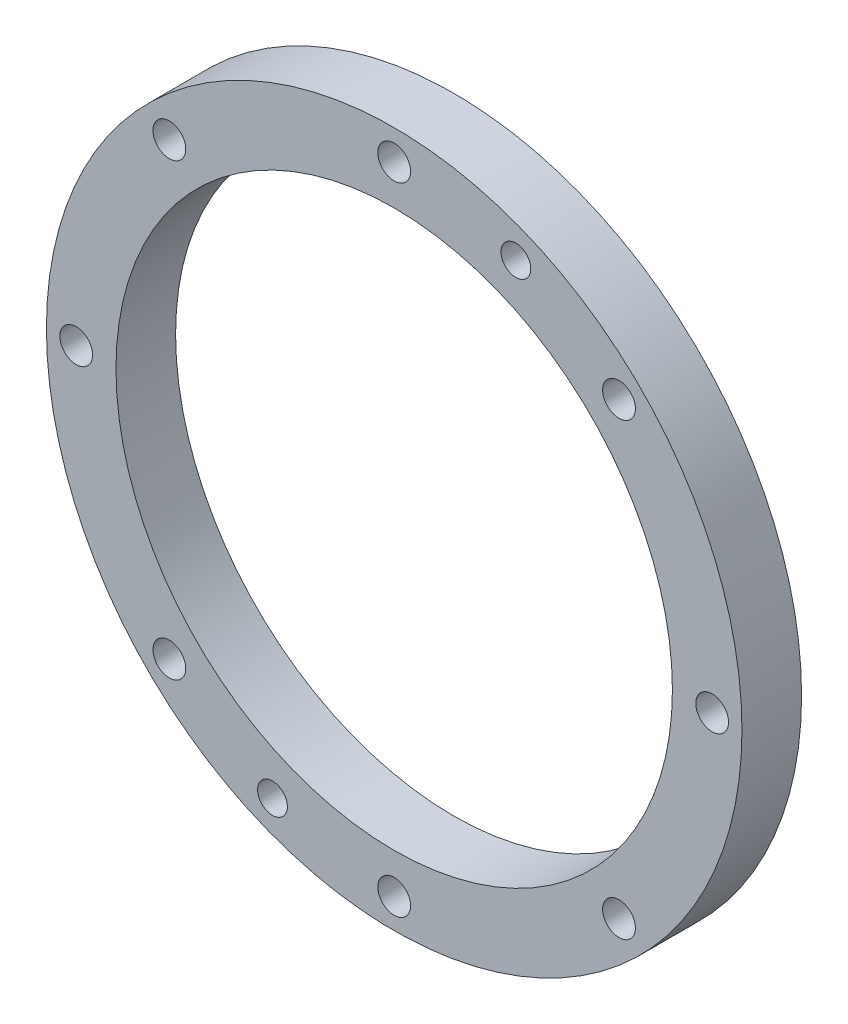
ISO-10303-21;
HEADER;
FILE_DESCRIPTION(('STEP AP214'),'2;1');
FILE_NAME('part.step','',(''),(''),'','','');
FILE_SCHEMA(('AUTOMOTIVE_DESIGN { 1 0 10303 214 1 1 1 1 }'));
ENDSEC;
DATA;
#1=APPLICATION_CONTEXT('core data for automotive mechanical design processes');
#2=APPLICATION_PROTOCOL_DEFINITION('international standard','automotive_design',2000,#1);
#3=PRODUCT_CONTEXT('',#1,'mechanical');
#4=PRODUCT('Part','Part','',(#3));
#5=PRODUCT_RELATED_PRODUCT_CATEGORY('part','',(#4));
#6=PRODUCT_DEFINITION_FORMATION('','',#4);
#7=PRODUCT_DEFINITION_CONTEXT('part definition',#1,'design');
#8=PRODUCT_DEFINITION('design','',#6,#7);
#9=PRODUCT_DEFINITION_SHAPE('','',#8);
#10=(LENGTH_UNIT() NAMED_UNIT(*) SI_UNIT(.MILLI.,.METRE.));
#11=(NAMED_UNIT(*) PLANE_ANGLE_UNIT() SI_UNIT($,.RADIAN.));
#12=(NAMED_UNIT(*) SI_UNIT($,.STERADIAN.) SOLID_ANGLE_UNIT());
#13=UNCERTAINTY_MEASURE_WITH_UNIT(LENGTH_MEASURE(1.E-05),#10,'distance_accuracy_value','');
#14=(GEOMETRIC_REPRESENTATION_CONTEXT(3) GLOBAL_UNCERTAINTY_ASSIGNED_CONTEXT((#13)) GLOBAL_UNIT_ASSIGNED_CONTEXT((#10,
#11,#12)) REPRESENTATION_CONTEXT('',''));
#15=CARTESIAN_POINT('',(0.,0.,0.));
#16=DIRECTION('',(0.,0.,1.));
#17=DIRECTION('',(1.,0.,0.));
#18=AXIS2_PLACEMENT_3D('',#15,#16,#17);
#19=CARTESIAN_POINT('',(0.,0.,150.));
#20=DIRECTION('',(0.,0.,1.));
#21=DIRECTION('',(1.,0.,0.));
#22=AXIS2_PLACEMENT_3D('',#19,#20,#21);
#23=CYLINDRICAL_SURFACE('',#22,56.);
#24=CARTESIAN_POINT('',(0.,0.,-7.50000000000001));
#25=DIRECTION('',(0.,0.,1.));
#26=DIRECTION('',(1.,0.,0.));
#27=AXIS2_PLACEMENT_3D('',#24,#25,#26);
#28=CIRCLE('',#27,56.);
#29=CARTESIAN_POINT('',(56.,0.,-7.50000000000001));
#30=VERTEX_POINT('',#29);
#31=EDGE_CURVE('E117',#30,#30,#28,.T.);
#32=ORIENTED_EDGE('',*,*,#31,.T.);
#33=EDGE_LOOP('',(#32));
#34=FACE_BOUND('',#33,.T.);
#35=CARTESIAN_POINT('',(0.,0.,-19.5));
#36=DIRECTION('',(0.,0.,1.));
#37=DIRECTION('',(1.,0.,0.));
#38=AXIS2_PLACEMENT_3D('',#35,#36,#37);
#39=CIRCLE('',#38,56.);
#40=CARTESIAN_POINT('',(56.,0.,-19.5));
#41=VERTEX_POINT('',#40);
#42=EDGE_CURVE('E10',#41,#41,#39,.T.);
#43=ORIENTED_EDGE('',*,*,#42,.F.);
#44=EDGE_LOOP('',(#43));
#45=FACE_BOUND('',#44,.T.);
#46=ADVANCED_FACE('F39',(#34,#45),#23,.F.);
#47=CARTESIAN_POINT('',(56.,0.,-19.5));
#48=DIRECTION('',(0.,0.,-1.));
#49=DIRECTION('',(-1.,0.,0.));
#50=AXIS2_PLACEMENT_3D('',#47,#48,#49);
#51=PLANE('',#50);
#52=CARTESIAN_POINT('',(64.,0.,-19.5));
#53=DIRECTION('',(0.,0.,-1.));
#54=DIRECTION('',(-1.,0.,0.));
#55=AXIS2_PLACEMENT_3D('',#52,#53,#54);
#56=CIRCLE('',#55,3.3);
#57=CARTESIAN_POINT('',(60.7,0.,-19.5));
#58=VERTEX_POINT('',#57);
#59=EDGE_CURVE('E118',#58,#58,#56,.F.);
#60=ORIENTED_EDGE('',*,*,#59,.T.);
#61=EDGE_LOOP('',(#60));
#62=FACE_BOUND('',#61,.T.);
#63=CARTESIAN_POINT('',(-24.4917,-59.1283,-19.5));
#64=DIRECTION('',(0.,0.,-1.));
#65=DIRECTION('',(-1.,0.,0.));
#66=AXIS2_PLACEMENT_3D('',#63,#64,#65);
#67=CIRCLE('',#66,3.);
#68=CARTESIAN_POINT('',(-27.4917,-59.1283,-19.5));
#69=VERTEX_POINT('',#68);
#70=EDGE_CURVE('E99',#69,#69,#67,.F.);
#71=ORIENTED_EDGE('',*,*,#70,.T.);
#72=EDGE_LOOP('',(#71));
#73=FACE_BOUND('',#72,.T.);
#74=CARTESIAN_POINT('',(45.2548,45.2548,-19.5));
#75=DIRECTION('',(0.,0.,-1.));
#76=DIRECTION('',(-1.,0.,0.));
#77=AXIS2_PLACEMENT_3D('',#74,#75,#76);
#78=CIRCLE('',#77,3.3);
#79=CARTESIAN_POINT('',(41.9548,45.2548,-19.5));
#80=VERTEX_POINT('',#79);
#81=EDGE_CURVE('E96',#80,#80,#78,.F.);
#82=ORIENTED_EDGE('',*,*,#81,.T.);
#83=EDGE_LOOP('',(#82));
#84=FACE_BOUND('',#83,.T.);
#85=CARTESIAN_POINT('',(0.,64.,-19.5));
#86=DIRECTION('',(0.,0.,-1.));
#87=DIRECTION('',(-1.,0.,0.));
#88=AXIS2_PLACEMENT_3D('',#85,#86,#87);
#89=CIRCLE('',#88,3.3);
#90=CARTESIAN_POINT('',(-3.3,64.,-19.5));
#91=VERTEX_POINT('',#90);
#92=EDGE_CURVE('E95',#91,#91,#89,.F.);
#93=ORIENTED_EDGE('',*,*,#92,.T.);
#94=EDGE_LOOP('',(#93));
#95=FACE_BOUND('',#94,.T.);
#96=CARTESIAN_POINT('',(-45.2548,45.2548,-19.5));
#97=DIRECTION('',(0.,0.,-1.));
#98=DIRECTION('',(-1.,0.,0.));
#99=AXIS2_PLACEMENT_3D('',#96,#97,#98);
#100=CIRCLE('',#99,3.3);
#101=CARTESIAN_POINT('',(-48.5548,45.2548,-19.5));
#102=VERTEX_POINT('',#101);
#103=EDGE_CURVE('E87',#102,#102,#100,.F.);
#104=ORIENTED_EDGE('',*,*,#103,.T.);
#105=EDGE_LOOP('',(#104));
#106=FACE_BOUND('',#105,.T.);
#107=CARTESIAN_POINT('',(-64.,0.,-19.5));
#108=DIRECTION('',(0.,0.,-1.));
#109=DIRECTION('',(-1.,0.,0.));
#110=AXIS2_PLACEMENT_3D('',#107,#108,#109);
#111=CIRCLE('',#110,3.3);
#112=CARTESIAN_POINT('',(-67.3,0.,-19.5));
#113=VERTEX_POINT('',#112);
#114=EDGE_CURVE('E85',#113,#113,#111,.F.);
#115=ORIENTED_EDGE('',*,*,#114,.T.);
#116=EDGE_LOOP('',(#115));
#117=FACE_BOUND('',#116,.T.);
#118=CARTESIAN_POINT('',(-45.2548,-45.2548,-19.5));
#119=DIRECTION('',(0.,0.,-1.));
#120=DIRECTION('',(-1.,0.,0.));
#121=AXIS2_PLACEMENT_3D('',#118,#119,#120);
#122=CIRCLE('',#121,3.3);
#123=CARTESIAN_POINT('',(-48.5548,-45.2548,-19.5));
#124=VERTEX_POINT('',#123);
#125=EDGE_CURVE('E80',#124,#124,#122,.F.);
#126=ORIENTED_EDGE('',*,*,#125,.T.);
#127=EDGE_LOOP('',(#126));
#128=FACE_BOUND('',#127,.T.);
#129=CARTESIAN_POINT('',(0.,-64.,-19.5));
#130=DIRECTION('',(0.,0.,-1.));
#131=DIRECTION('',(-1.,0.,0.));
#132=AXIS2_PLACEMENT_3D('',#129,#130,#131);
#133=CIRCLE('',#132,3.3);
#134=CARTESIAN_POINT('',(-3.3,-64.,-19.5));
#135=VERTEX_POINT('',#134);
#136=EDGE_CURVE('E75',#135,#135,#133,.F.);
#137=ORIENTED_EDGE('',*,*,#136,.T.);
#138=EDGE_LOOP('',(#137));
#139=FACE_BOUND('',#138,.T.);
#140=CARTESIAN_POINT('',(45.2548,-45.2548,-19.5));
#141=DIRECTION('',(0.,0.,-1.));
#142=DIRECTION('',(-1.,0.,0.));
#143=AXIS2_PLACEMENT_3D('',#140,#141,#142);
#144=CIRCLE('',#143,3.3);
#145=CARTESIAN_POINT('',(41.9548,-45.2548,-19.5));
#146=VERTEX_POINT('',#145);
#147=EDGE_CURVE('E70',#146,#146,#144,.F.);
#148=ORIENTED_EDGE('',*,*,#147,.T.);
#149=EDGE_LOOP('',(#148));
#150=FACE_BOUND('',#149,.T.);
#151=CARTESIAN_POINT('',(24.4917,59.1283,-19.5));
#152=DIRECTION('',(0.,0.,-1.));
#153=DIRECTION('',(-1.,0.,0.));
#154=AXIS2_PLACEMENT_3D('',#151,#152,#153);
#155=CIRCLE('',#154,3.);
#156=CARTESIAN_POINT('',(21.4917,59.1283,-19.5));
#157=VERTEX_POINT('',#156);
#158=EDGE_CURVE('E65',#157,#157,#155,.F.);
#159=ORIENTED_EDGE('',*,*,#158,.T.);
#160=EDGE_LOOP('',(#159));
#161=FACE_BOUND('',#160,.T.);
#162=ORIENTED_EDGE('',*,*,#42,.T.);
#163=EDGE_LOOP('',(#162));
#164=FACE_BOUND('',#163,.T.);
#165=CARTESIAN_POINT('',(0.,0.,-19.5));
#166=DIRECTION('',(0.,0.,1.));
#167=DIRECTION('',(1.,0.,0.));
#168=AXIS2_PLACEMENT_3D('',#165,#166,#167);
#169=CIRCLE('',#168,70.);
#170=CARTESIAN_POINT('',(70.,0.,-19.5));
#171=VERTEX_POINT('',#170);
#172=EDGE_CURVE('E50',#171,#171,#169,.T.);
#173=ORIENTED_EDGE('',*,*,#172,.F.);
#174=EDGE_LOOP('',(#173));
#175=FACE_BOUND('',#174,.T.);
#176=ADVANCED_FACE('F131',(#62,#73,#84,#95,#106,#117,#128,#139,#150,#161,#164,#175),#51,.T.);
#177=CARTESIAN_POINT('',(0.,0.,150.));
#178=DIRECTION('',(0.,0.,1.));
#179=DIRECTION('',(1.,0.,0.));
#180=AXIS2_PLACEMENT_3D('',#177,#178,#179);
#181=CYLINDRICAL_SURFACE('',#180,70.);
#182=ORIENTED_EDGE('',*,*,#172,.T.);
#183=EDGE_LOOP('',(#182));
#184=FACE_BOUND('',#183,.T.);
#185=CARTESIAN_POINT('',(0.,0.,-7.50000000000001));
#186=DIRECTION('',(0.,0.,1.));
#187=DIRECTION('',(1.,0.,0.));
#188=AXIS2_PLACEMENT_3D('',#185,#186,#187);
#189=CIRCLE('',#188,70.);
#190=CARTESIAN_POINT('',(70.,0.,-7.50000000000001));
#191=VERTEX_POINT('',#190);
#192=EDGE_CURVE('E53',#191,#191,#189,.T.);
#193=ORIENTED_EDGE('',*,*,#192,.F.);
#194=EDGE_LOOP('',(#193));
#195=FACE_BOUND('',#194,.T.);
#196=ADVANCED_FACE('F133',(#184,#195),#181,.T.);
#197=CARTESIAN_POINT('',(70.,0.,-7.5));
#198=DIRECTION('',(0.,0.,1.));
#199=DIRECTION('',(1.,0.,0.));
#200=AXIS2_PLACEMENT_3D('',#197,#198,#199);
#201=PLANE('',#200);
#202=CARTESIAN_POINT('',(64.,0.,-7.50000000000001));
#203=DIRECTION('',(0.,0.,1.));
#204=DIRECTION('',(1.,0.,0.));
#205=AXIS2_PLACEMENT_3D('',#202,#203,#204);
#206=CIRCLE('',#205,3.3);
#207=CARTESIAN_POINT('',(67.3,0.,-7.50000000000001));
#208=VERTEX_POINT('',#207);
#209=EDGE_CURVE('E45',#208,#208,#206,.F.);
#210=ORIENTED_EDGE('',*,*,#209,.T.);
#211=EDGE_LOOP('',(#210));
#212=FACE_BOUND('',#211,.T.);
#213=CARTESIAN_POINT('',(-24.4917,-59.1283,-7.50000000000001));
#214=DIRECTION('',(0.,0.,1.));
#215=DIRECTION('',(1.,0.,0.));
#216=AXIS2_PLACEMENT_3D('',#213,#214,#215);
#217=CIRCLE('',#216,3.);
#218=CARTESIAN_POINT('',(-21.4917,-59.1283,-7.50000000000001));
#219=VERTEX_POINT('',#218);
#220=EDGE_CURVE('E100',#219,#219,#217,.F.);
#221=ORIENTED_EDGE('',*,*,#220,.T.);
#222=EDGE_LOOP('',(#221));
#223=FACE_BOUND('',#222,.T.);
#224=CARTESIAN_POINT('',(45.2548,45.2548,-7.50000000000001));
#225=DIRECTION('',(0.,0.,1.));
#226=DIRECTION('',(1.,0.,0.));
#227=AXIS2_PLACEMENT_3D('',#224,#225,#226);
#228=CIRCLE('',#227,3.3);
#229=CARTESIAN_POINT('',(48.5548,45.2548,-7.50000000000001));
#230=VERTEX_POINT('',#229);
#231=EDGE_CURVE('E91',#230,#230,#228,.F.);
#232=ORIENTED_EDGE('',*,*,#231,.T.);
#233=EDGE_LOOP('',(#232));
#234=FACE_BOUND('',#233,.T.);
#235=CARTESIAN_POINT('',(0.,64.,-7.50000000000001));
#236=DIRECTION('',(0.,0.,1.));
#237=DIRECTION('',(1.,0.,0.));
#238=AXIS2_PLACEMENT_3D('',#235,#236,#237);
#239=CIRCLE('',#238,3.3);
#240=CARTESIAN_POINT('',(3.3,64.,-7.50000000000001));
#241=VERTEX_POINT('',#240);
#242=EDGE_CURVE('E86',#241,#241,#239,.F.);
#243=ORIENTED_EDGE('',*,*,#242,.T.);
#244=EDGE_LOOP('',(#243));
#245=FACE_BOUND('',#244,.T.);
#246=CARTESIAN_POINT('',(-45.2548,45.2548,-7.50000000000001));
#247=DIRECTION('',(0.,0.,1.));
#248=DIRECTION('',(1.,0.,0.));
#249=AXIS2_PLACEMENT_3D('',#246,#247,#248);
#250=CIRCLE('',#249,3.3);
#251=CARTESIAN_POINT('',(-41.9548,45.2548,-7.50000000000001));
#252=VERTEX_POINT('',#251);
#253=EDGE_CURVE('E83',#252,#252,#250,.F.);
#254=ORIENTED_EDGE('',*,*,#253,.T.);
#255=EDGE_LOOP('',(#254));
#256=FACE_BOUND('',#255,.T.);
#257=CARTESIAN_POINT('',(-64.,0.,-7.50000000000001));
#258=DIRECTION('',(0.,0.,1.));
#259=DIRECTION('',(1.,0.,0.));
#260=AXIS2_PLACEMENT_3D('',#257,#258,#259);
#261=CIRCLE('',#260,3.3);
#262=CARTESIAN_POINT('',(-60.7,0.,-7.50000000000001));
#263=VERTEX_POINT('',#262);
#264=EDGE_CURVE('E76',#263,#263,#261,.F.);
#265=ORIENTED_EDGE('',*,*,#264,.T.);
#266=EDGE_LOOP('',(#265));
#267=FACE_BOUND('',#266,.T.);
#268=CARTESIAN_POINT('',(-45.2548,-45.2548,-7.50000000000001));
#269=DIRECTION('',(0.,0.,1.));
#270=DIRECTION('',(1.,0.,0.));
#271=AXIS2_PLACEMENT_3D('',#268,#269,#270);
#272=CIRCLE('',#271,3.3);
#273=CARTESIAN_POINT('',(-41.9548,-45.2548,-7.50000000000001));
#274=VERTEX_POINT('',#273);
#275=EDGE_CURVE('E71',#274,#274,#272,.F.);
#276=ORIENTED_EDGE('',*,*,#275,.T.);
#277=EDGE_LOOP('',(#276));
#278=FACE_BOUND('',#277,.T.);
#279=CARTESIAN_POINT('',(0.,-64.,-7.50000000000001));
#280=DIRECTION('',(0.,0.,1.));
#281=DIRECTION('',(1.,0.,0.));
#282=AXIS2_PLACEMENT_3D('',#279,#280,#281);
#283=CIRCLE('',#282,3.3);
#284=CARTESIAN_POINT('',(3.3,-64.,-7.50000000000001));
#285=VERTEX_POINT('',#284);
#286=EDGE_CURVE('E68',#285,#285,#283,.F.);
#287=ORIENTED_EDGE('',*,*,#286,.T.);
#288=EDGE_LOOP('',(#287));
#289=FACE_BOUND('',#288,.T.);
#290=CARTESIAN_POINT('',(45.2548,-45.2548,-7.50000000000001));
#291=DIRECTION('',(0.,0.,1.));
#292=DIRECTION('',(1.,0.,0.));
#293=AXIS2_PLACEMENT_3D('',#290,#291,#292);
#294=CIRCLE('',#293,3.3);
#295=CARTESIAN_POINT('',(48.5548,-45.2548,-7.50000000000001));
#296=VERTEX_POINT('',#295);
#297=EDGE_CURVE('E61',#296,#296,#294,.F.);
#298=ORIENTED_EDGE('',*,*,#297,.T.);
#299=EDGE_LOOP('',(#298));
#300=FACE_BOUND('',#299,.T.);
#301=CARTESIAN_POINT('',(24.4917,59.1283,-7.50000000000001));
#302=DIRECTION('',(0.,0.,1.));
#303=DIRECTION('',(1.,0.,0.));
#304=AXIS2_PLACEMENT_3D('',#301,#302,#303);
#305=CIRCLE('',#304,3.);
#306=CARTESIAN_POINT('',(27.4917,59.1283,-7.50000000000001));
#307=VERTEX_POINT('',#306);
#308=EDGE_CURVE('E59',#307,#307,#305,.F.);
#309=ORIENTED_EDGE('',*,*,#308,.T.);
#310=EDGE_LOOP('',(#309));
#311=FACE_BOUND('',#310,.T.);
#312=ORIENTED_EDGE('',*,*,#192,.T.);
#313=EDGE_LOOP('',(#312));
#314=FACE_BOUND('',#313,.T.);
#315=ORIENTED_EDGE('',*,*,#31,.F.);
#316=EDGE_LOOP('',(#315));
#317=FACE_BOUND('',#316,.T.);
#318=ADVANCED_FACE('F126',(#212,#223,#234,#245,#256,#267,#278,#289,#300,#311,#314,#317),#201,.T.);
#319=CARTESIAN_POINT('',(24.4917,59.1283,150.));
#320=DIRECTION('',(0.,0.,-1.));
#321=DIRECTION('',(-1.,0.,0.));
#322=AXIS2_PLACEMENT_3D('',#319,#320,#321);
#323=CYLINDRICAL_SURFACE('',#322,3.);
#324=ORIENTED_EDGE('',*,*,#158,.F.);
#325=EDGE_LOOP('',(#324));
#326=FACE_BOUND('',#325,.T.);
#327=ORIENTED_EDGE('',*,*,#308,.F.);
#328=EDGE_LOOP('',(#327));
#329=FACE_BOUND('',#328,.T.);
#330=ADVANCED_FACE('F143',(#326,#329),#323,.F.);
#331=CARTESIAN_POINT('',(45.2548,-45.2548,150.));
#332=DIRECTION('',(0.,0.,-1.));
#333=DIRECTION('',(-1.,0.,0.));
#334=AXIS2_PLACEMENT_3D('',#331,#332,#333);
#335=CYLINDRICAL_SURFACE('',#334,3.3);
#336=ORIENTED_EDGE('',*,*,#147,.F.);
#337=EDGE_LOOP('',(#336));
#338=FACE_BOUND('',#337,.T.);
#339=ORIENTED_EDGE('',*,*,#297,.F.);
#340=EDGE_LOOP('',(#339));
#341=FACE_BOUND('',#340,.T.);
#342=ADVANCED_FACE('F177',(#338,#341),#335,.F.);
#343=CARTESIAN_POINT('',(0.,-64.,150.));
#344=DIRECTION('',(0.,0.,-1.));
#345=DIRECTION('',(-1.,0.,0.));
#346=AXIS2_PLACEMENT_3D('',#343,#344,#345);
#347=CYLINDRICAL_SURFACE('',#346,3.3);
#348=ORIENTED_EDGE('',*,*,#136,.F.);
#349=EDGE_LOOP('',(#348));
#350=FACE_BOUND('',#349,.T.);
#351=ORIENTED_EDGE('',*,*,#286,.F.);
#352=EDGE_LOOP('',(#351));
#353=FACE_BOUND('',#352,.T.);
#354=ADVANCED_FACE('F188',(#350,#353),#347,.F.);
#355=CARTESIAN_POINT('',(-45.2548,-45.2548,150.));
#356=DIRECTION('',(0.,0.,-1.));
#357=DIRECTION('',(-1.,0.,0.));
#358=AXIS2_PLACEMENT_3D('',#355,#356,#357);
#359=CYLINDRICAL_SURFACE('',#358,3.3);
#360=ORIENTED_EDGE('',*,*,#125,.F.);
#361=EDGE_LOOP('',(#360));
#362=FACE_BOUND('',#361,.T.);
#363=ORIENTED_EDGE('',*,*,#275,.F.);
#364=EDGE_LOOP('',(#363));
#365=FACE_BOUND('',#364,.T.);
#366=ADVANCED_FACE('F198',(#362,#365),#359,.F.);
#367=CARTESIAN_POINT('',(-64.,0.,150.));
#368=DIRECTION('',(0.,0.,-1.));
#369=DIRECTION('',(-1.,0.,0.));
#370=AXIS2_PLACEMENT_3D('',#367,#368,#369);
#371=CYLINDRICAL_SURFACE('',#370,3.3);
#372=ORIENTED_EDGE('',*,*,#114,.F.);
#373=EDGE_LOOP('',(#372));
#374=FACE_BOUND('',#373,.T.);
#375=ORIENTED_EDGE('',*,*,#264,.F.);
#376=EDGE_LOOP('',(#375));
#377=FACE_BOUND('',#376,.T.);
#378=ADVANCED_FACE('F206',(#374,#377),#371,.F.);
#379=CARTESIAN_POINT('',(-45.2548,45.2548,150.));
#380=DIRECTION('',(0.,0.,-1.));
#381=DIRECTION('',(-1.,0.,0.));
#382=AXIS2_PLACEMENT_3D('',#379,#380,#381);
#383=CYLINDRICAL_SURFACE('',#382,3.3);
#384=ORIENTED_EDGE('',*,*,#103,.F.);
#385=EDGE_LOOP('',(#384));
#386=FACE_BOUND('',#385,.T.);
#387=ORIENTED_EDGE('',*,*,#253,.F.);
#388=EDGE_LOOP('',(#387));
#389=FACE_BOUND('',#388,.T.);
#390=ADVANCED_FACE('F216',(#386,#389),#383,.F.);
#391=CARTESIAN_POINT('',(0.,64.,150.));
#392=DIRECTION('',(0.,0.,-1.));
#393=DIRECTION('',(-1.,0.,0.));
#394=AXIS2_PLACEMENT_3D('',#391,#392,#393);
#395=CYLINDRICAL_SURFACE('',#394,3.3);
#396=ORIENTED_EDGE('',*,*,#92,.F.);
#397=EDGE_LOOP('',(#396));
#398=FACE_BOUND('',#397,.T.);
#399=ORIENTED_EDGE('',*,*,#242,.F.);
#400=EDGE_LOOP('',(#399));
#401=FACE_BOUND('',#400,.T.);
#402=ADVANCED_FACE('F228',(#398,#401),#395,.F.);
#403=CARTESIAN_POINT('',(45.2548,45.2548,150.));
#404=DIRECTION('',(0.,0.,-1.));
#405=DIRECTION('',(-1.,0.,0.));
#406=AXIS2_PLACEMENT_3D('',#403,#404,#405);
#407=CYLINDRICAL_SURFACE('',#406,3.3);
#408=ORIENTED_EDGE('',*,*,#81,.F.);
#409=EDGE_LOOP('',(#408));
#410=FACE_BOUND('',#409,.T.);
#411=ORIENTED_EDGE('',*,*,#231,.F.);
#412=EDGE_LOOP('',(#411));
#413=FACE_BOUND('',#412,.T.);
#414=ADVANCED_FACE('F237',(#410,#413),#407,.F.);
#415=CARTESIAN_POINT('',(-24.4917,-59.1283,150.));
#416=DIRECTION('',(0.,0.,-1.));
#417=DIRECTION('',(-1.,0.,0.));
#418=AXIS2_PLACEMENT_3D('',#415,#416,#417);
#419=CYLINDRICAL_SURFACE('',#418,3.);
#420=ORIENTED_EDGE('',*,*,#70,.F.);
#421=EDGE_LOOP('',(#420));
#422=FACE_BOUND('',#421,.T.);
#423=ORIENTED_EDGE('',*,*,#220,.F.);
#424=EDGE_LOOP('',(#423));
#425=FACE_BOUND('',#424,.T.);
#426=ADVANCED_FACE('F247',(#422,#425),#419,.F.);
#427=CARTESIAN_POINT('',(64.,0.,150.));
#428=DIRECTION('',(0.,0.,-1.));
#429=DIRECTION('',(-1.,0.,0.));
#430=AXIS2_PLACEMENT_3D('',#427,#428,#429);
#431=CYLINDRICAL_SURFACE('',#430,3.3);
#432=ORIENTED_EDGE('',*,*,#59,.F.);
#433=EDGE_LOOP('',(#432));
#434=FACE_BOUND('',#433,.T.);
#435=ORIENTED_EDGE('',*,*,#209,.F.);
#436=EDGE_LOOP('',(#435));
#437=FACE_BOUND('',#436,.T.);
#438=ADVANCED_FACE('F258',(#434,#437),#431,.F.);
#439=CLOSED_SHELL('',(#46,#176,#196,#318,#330,#342,#354,#366,#378,#390,#402,#414,#426,#438));
#440=MANIFOLD_SOLID_BREP('B2',#439);
#441=ADVANCED_BREP_SHAPE_REPRESENTATION('',(#18,#440),#14);
#442=SHAPE_DEFINITION_REPRESENTATION(#9,#441);
ENDSEC;
END-ISO-10303-21;
